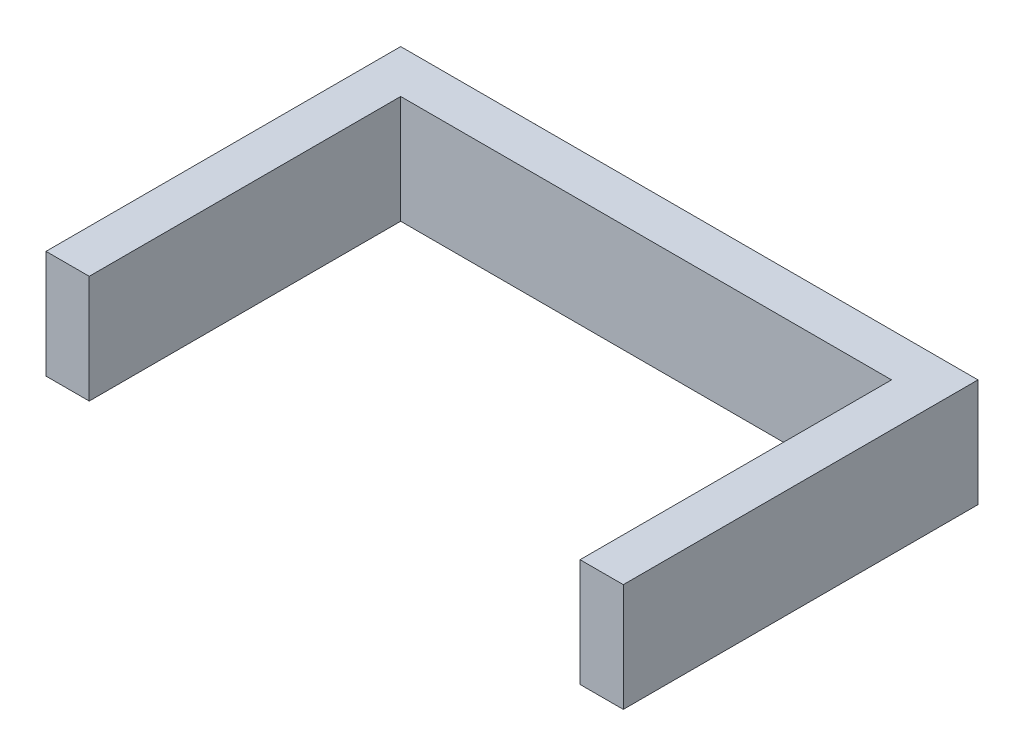
ISO-10303-21;
HEADER;
FILE_DESCRIPTION(('STEP AP214'),'2;1');
FILE_NAME('part.step','',(''),(''),'','','');
FILE_SCHEMA(('AUTOMOTIVE_DESIGN { 1 0 10303 214 1 1 1 1 }'));
ENDSEC;
DATA;
#1=APPLICATION_CONTEXT('core data for automotive mechanical design processes');
#2=APPLICATION_PROTOCOL_DEFINITION('international standard','automotive_design',2000,#1);
#3=PRODUCT_CONTEXT('',#1,'mechanical');
#4=PRODUCT('Part','Part','',(#3));
#5=PRODUCT_RELATED_PRODUCT_CATEGORY('part','',(#4));
#6=PRODUCT_DEFINITION_FORMATION('','',#4);
#7=PRODUCT_DEFINITION_CONTEXT('part definition',#1,'design');
#8=PRODUCT_DEFINITION('design','',#6,#7);
#9=PRODUCT_DEFINITION_SHAPE('','',#8);
#10=(LENGTH_UNIT() NAMED_UNIT(*) SI_UNIT(.MILLI.,.METRE.));
#11=(NAMED_UNIT(*) PLANE_ANGLE_UNIT() SI_UNIT($,.RADIAN.));
#12=(NAMED_UNIT(*) SI_UNIT($,.STERADIAN.) SOLID_ANGLE_UNIT());
#13=UNCERTAINTY_MEASURE_WITH_UNIT(LENGTH_MEASURE(1.E-05),#10,'distance_accuracy_value','');
#14=(GEOMETRIC_REPRESENTATION_CONTEXT(3) GLOBAL_UNCERTAINTY_ASSIGNED_CONTEXT((#13)) GLOBAL_UNIT_ASSIGNED_CONTEXT((#10,
#11,#12)) REPRESENTATION_CONTEXT('',''));
#15=CARTESIAN_POINT('',(0.,0.,0.));
#16=DIRECTION('',(0.,0.,1.));
#17=DIRECTION('',(1.,0.,0.));
#18=AXIS2_PLACEMENT_3D('',#15,#16,#17);
#19=CARTESIAN_POINT('',(-2.,5.,0.));
#20=DIRECTION('',(0.,0.,-1.));
#21=DIRECTION('',(-1.,0.,0.));
#22=AXIS2_PLACEMENT_3D('',#19,#20,#21);
#23=PLANE('',#22);
#24=DIRECTION('',(1.,0.,0.));
#25=VECTOR('',#24,1.);
#26=CARTESIAN_POINT('',(-2.,0.,0.));
#27=LINE('',#26,#25);
#28=CARTESIAN_POINT('',(-2.,0.,0.));
#29=VERTEX_POINT('',#28);
#30=CARTESIAN_POINT('',(0.,0.,0.));
#31=VERTEX_POINT('',#30);
#32=EDGE_CURVE('E146',#29,#31,#27,.T.);
#33=ORIENTED_EDGE('',*,*,#32,.T.);
#34=DIRECTION('',(0.,-1.,0.));
#35=VECTOR('',#34,1.);
#36=CARTESIAN_POINT('',(0.,5.,0.));
#37=LINE('',#36,#35);
#38=CARTESIAN_POINT('',(0.,5.,0.));
#39=VERTEX_POINT('',#38);
#40=EDGE_CURVE('E11',#39,#31,#37,.T.);
#41=ORIENTED_EDGE('',*,*,#40,.F.);
#42=DIRECTION('',(1.,0.,0.));
#43=VECTOR('',#42,1.);
#44=CARTESIAN_POINT('',(-2.,5.,0.));
#45=LINE('',#44,#43);
#46=CARTESIAN_POINT('',(-2.,5.,0.));
#47=VERTEX_POINT('',#46);
#48=EDGE_CURVE('E168',#47,#39,#45,.T.);
#49=ORIENTED_EDGE('',*,*,#48,.F.);
#50=DIRECTION('',(0.,-1.,0.));
#51=VECTOR('',#50,1.);
#52=CARTESIAN_POINT('',(-2.,5.,0.));
#53=LINE('',#52,#51);
#54=EDGE_CURVE('E142',#47,#29,#53,.T.);
#55=ORIENTED_EDGE('',*,*,#54,.T.);
#56=EDGE_LOOP('',(#33,#41,#49,#55));
#57=FACE_BOUND('',#56,.T.);
#58=ADVANCED_FACE('F45',(#57),#23,.F.);
#59=CARTESIAN_POINT('',(0.,5.,0.));
#60=DIRECTION('',(-1.,0.,0.));
#61=DIRECTION('',(0.,0.,1.));
#62=AXIS2_PLACEMENT_3D('',#59,#60,#61);
#63=PLANE('',#62);
#64=DIRECTION('',(0.,0.,-1.));
#65=VECTOR('',#64,1.);
#66=CARTESIAN_POINT('',(0.,0.,0.));
#67=LINE('',#66,#65);
#68=CARTESIAN_POINT('',(0.,0.,-14.41));
#69=VERTEX_POINT('',#68);
#70=EDGE_CURVE('E150',#31,#69,#67,.T.);
#71=ORIENTED_EDGE('',*,*,#70,.T.);
#72=DIRECTION('',(0.,-1.,0.));
#73=VECTOR('',#72,1.);
#74=CARTESIAN_POINT('',(0.,5.,-14.41));
#75=LINE('',#74,#73);
#76=CARTESIAN_POINT('',(0.,5.,-14.41));
#77=VERTEX_POINT('',#76);
#78=EDGE_CURVE('E54',#77,#69,#75,.T.);
#79=ORIENTED_EDGE('',*,*,#78,.F.);
#80=DIRECTION('',(0.,0.,-1.));
#81=VECTOR('',#80,1.);
#82=CARTESIAN_POINT('',(0.,5.,0.));
#83=LINE('',#82,#81);
#84=EDGE_CURVE('E105',#39,#77,#83,.T.);
#85=ORIENTED_EDGE('',*,*,#84,.F.);
#86=ORIENTED_EDGE('',*,*,#40,.T.);
#87=EDGE_LOOP('',(#71,#79,#85,#86));
#88=FACE_BOUND('',#87,.T.);
#89=ADVANCED_FACE('F214',(#88),#63,.F.);
#90=CARTESIAN_POINT('',(0.,5.,-14.41));
#91=DIRECTION('',(0.,0.,-1.));
#92=DIRECTION('',(-1.,0.,0.));
#93=AXIS2_PLACEMENT_3D('',#90,#91,#92);
#94=PLANE('',#93);
#95=DIRECTION('',(1.,0.,0.));
#96=VECTOR('',#95,1.);
#97=CARTESIAN_POINT('',(0.,0.,-14.41));
#98=LINE('',#97,#96);
#99=CARTESIAN_POINT('',(22.71,0.,-14.41));
#100=VERTEX_POINT('',#99);
#101=EDGE_CURVE('E153',#69,#100,#98,.T.);
#102=ORIENTED_EDGE('',*,*,#101,.T.);
#103=DIRECTION('',(0.,-1.,0.));
#104=VECTOR('',#103,1.);
#105=CARTESIAN_POINT('',(22.71,5.,-14.41));
#106=LINE('',#105,#104);
#107=CARTESIAN_POINT('',(22.71,5.,-14.41));
#108=VERTEX_POINT('',#107);
#109=EDGE_CURVE('E179',#108,#100,#106,.T.);
#110=ORIENTED_EDGE('',*,*,#109,.F.);
#111=DIRECTION('',(1.,0.,0.));
#112=VECTOR('',#111,1.);
#113=CARTESIAN_POINT('',(0.,5.,-14.41));
#114=LINE('',#113,#112);
#115=EDGE_CURVE('E189',#77,#108,#114,.T.);
#116=ORIENTED_EDGE('',*,*,#115,.F.);
#117=ORIENTED_EDGE('',*,*,#78,.T.);
#118=EDGE_LOOP('',(#102,#110,#116,#117));
#119=FACE_BOUND('',#118,.T.);
#120=ADVANCED_FACE('F187',(#119),#94,.F.);
#121=CARTESIAN_POINT('',(22.71,5.,0.));
#122=DIRECTION('',(1.,0.,0.));
#123=DIRECTION('',(0.,0.,-1.));
#124=AXIS2_PLACEMENT_3D('',#121,#122,#123);
#125=PLANE('',#124);
#126=DIRECTION('',(0.,0.,1.));
#127=VECTOR('',#126,1.);
#128=CARTESIAN_POINT('',(22.71,0.,0.));
#129=LINE('',#128,#127);
#130=CARTESIAN_POINT('',(22.71,0.,0.));
#131=VERTEX_POINT('',#130);
#132=EDGE_CURVE('E156',#100,#131,#129,.T.);
#133=ORIENTED_EDGE('',*,*,#132,.T.);
#134=DIRECTION('',(0.,-1.,0.));
#135=VECTOR('',#134,1.);
#136=CARTESIAN_POINT('',(22.71,5.,0.));
#137=LINE('',#136,#135);
#138=CARTESIAN_POINT('',(22.71,5.,0.));
#139=VERTEX_POINT('',#138);
#140=EDGE_CURVE('E175',#139,#131,#137,.T.);
#141=ORIENTED_EDGE('',*,*,#140,.F.);
#142=DIRECTION('',(0.,0.,1.));
#143=VECTOR('',#142,1.);
#144=CARTESIAN_POINT('',(22.71,5.,0.));
#145=LINE('',#144,#143);
#146=EDGE_CURVE('E202',#108,#139,#145,.T.);
#147=ORIENTED_EDGE('',*,*,#146,.F.);
#148=ORIENTED_EDGE('',*,*,#109,.T.);
#149=EDGE_LOOP('',(#133,#141,#147,#148));
#150=FACE_BOUND('',#149,.T.);
#151=ADVANCED_FACE('F197',(#150),#125,.F.);
#152=CARTESIAN_POINT('',(22.71,5.,0.));
#153=DIRECTION('',(0.,0.,-1.));
#154=DIRECTION('',(-1.,0.,0.));
#155=AXIS2_PLACEMENT_3D('',#152,#153,#154);
#156=PLANE('',#155);
#157=DIRECTION('',(1.,0.,0.));
#158=VECTOR('',#157,1.);
#159=CARTESIAN_POINT('',(22.71,0.,0.));
#160=LINE('',#159,#158);
#161=CARTESIAN_POINT('',(24.71,0.,0.));
#162=VERTEX_POINT('',#161);
#163=EDGE_CURVE('E159',#131,#162,#160,.T.);
#164=ORIENTED_EDGE('',*,*,#163,.T.);
#165=DIRECTION('',(0.,-1.,0.));
#166=VECTOR('',#165,1.);
#167=CARTESIAN_POINT('',(24.71,5.,0.));
#168=LINE('',#167,#166);
#169=CARTESIAN_POINT('',(24.71,5.,0.));
#170=VERTEX_POINT('',#169);
#171=EDGE_CURVE('E135',#170,#162,#168,.T.);
#172=ORIENTED_EDGE('',*,*,#171,.F.);
#173=DIRECTION('',(1.,0.,0.));
#174=VECTOR('',#173,1.);
#175=CARTESIAN_POINT('',(22.71,5.,0.));
#176=LINE('',#175,#174);
#177=EDGE_CURVE('E124',#139,#170,#176,.T.);
#178=ORIENTED_EDGE('',*,*,#177,.F.);
#179=ORIENTED_EDGE('',*,*,#140,.T.);
#180=EDGE_LOOP('',(#164,#172,#178,#179));
#181=FACE_BOUND('',#180,.T.);
#182=ADVANCED_FACE('F200',(#181),#156,.F.);
#183=CARTESIAN_POINT('',(24.71,5.,0.));
#184=DIRECTION('',(-1.,0.,0.));
#185=DIRECTION('',(0.,0.,1.));
#186=AXIS2_PLACEMENT_3D('',#183,#184,#185);
#187=PLANE('',#186);
#188=DIRECTION('',(0.,0.,-1.));
#189=VECTOR('',#188,1.);
#190=CARTESIAN_POINT('',(24.71,0.,0.));
#191=LINE('',#190,#189);
#192=CARTESIAN_POINT('',(24.71,0.,-16.41));
#193=VERTEX_POINT('',#192);
#194=EDGE_CURVE('E133',#162,#193,#191,.T.);
#195=ORIENTED_EDGE('',*,*,#194,.T.);
#196=DIRECTION('',(0.,-1.,0.));
#197=VECTOR('',#196,1.);
#198=CARTESIAN_POINT('',(24.71,5.,-16.41));
#199=LINE('',#198,#197);
#200=CARTESIAN_POINT('',(24.71,5.,-16.41));
#201=VERTEX_POINT('',#200);
#202=EDGE_CURVE('E130',#201,#193,#199,.T.);
#203=ORIENTED_EDGE('',*,*,#202,.F.);
#204=DIRECTION('',(0.,0.,-1.));
#205=VECTOR('',#204,1.);
#206=CARTESIAN_POINT('',(24.71,5.,0.));
#207=LINE('',#206,#205);
#208=EDGE_CURVE('E118',#170,#201,#207,.T.);
#209=ORIENTED_EDGE('',*,*,#208,.F.);
#210=ORIENTED_EDGE('',*,*,#171,.T.);
#211=EDGE_LOOP('',(#195,#203,#209,#210));
#212=FACE_BOUND('',#211,.T.);
#213=ADVANCED_FACE('F131',(#212),#187,.F.);
#214=CARTESIAN_POINT('',(-2.,5.,-16.41));
#215=DIRECTION('',(0.,0.,1.));
#216=DIRECTION('',(1.,0.,0.));
#217=AXIS2_PLACEMENT_3D('',#214,#215,#216);
#218=PLANE('',#217);
#219=DIRECTION('',(-1.,0.,0.));
#220=VECTOR('',#219,1.);
#221=CARTESIAN_POINT('',(-2.,0.,-16.41));
#222=LINE('',#221,#220);
#223=CARTESIAN_POINT('',(-2.,0.,-16.41));
#224=VERTEX_POINT('',#223);
#225=EDGE_CURVE('E91',#193,#224,#222,.T.);
#226=ORIENTED_EDGE('',*,*,#225,.T.);
#227=DIRECTION('',(0.,-1.,0.));
#228=VECTOR('',#227,1.);
#229=CARTESIAN_POINT('',(-2.,5.,-16.41));
#230=LINE('',#229,#228);
#231=CARTESIAN_POINT('',(-2.,5.,-16.41));
#232=VERTEX_POINT('',#231);
#233=EDGE_CURVE('E136',#232,#224,#230,.T.);
#234=ORIENTED_EDGE('',*,*,#233,.F.);
#235=DIRECTION('',(-1.,0.,0.));
#236=VECTOR('',#235,1.);
#237=CARTESIAN_POINT('',(-2.,5.,-16.41));
#238=LINE('',#237,#236);
#239=EDGE_CURVE('E122',#201,#232,#238,.T.);
#240=ORIENTED_EDGE('',*,*,#239,.F.);
#241=ORIENTED_EDGE('',*,*,#202,.T.);
#242=EDGE_LOOP('',(#226,#234,#240,#241));
#243=FACE_BOUND('',#242,.T.);
#244=ADVANCED_FACE('F138',(#243),#218,.F.);
#245=CARTESIAN_POINT('',(-2.,5.,0.));
#246=DIRECTION('',(1.,0.,0.));
#247=DIRECTION('',(0.,0.,-1.));
#248=AXIS2_PLACEMENT_3D('',#245,#246,#247);
#249=PLANE('',#248);
#250=DIRECTION('',(0.,0.,1.));
#251=VECTOR('',#250,1.);
#252=CARTESIAN_POINT('',(-2.,0.,0.));
#253=LINE('',#252,#251);
#254=EDGE_CURVE('E97',#224,#29,#253,.T.);
#255=ORIENTED_EDGE('',*,*,#254,.T.);
#256=ORIENTED_EDGE('',*,*,#54,.F.);
#257=DIRECTION('',(0.,0.,1.));
#258=VECTOR('',#257,1.);
#259=CARTESIAN_POINT('',(-2.,5.,0.));
#260=LINE('',#259,#258);
#261=EDGE_CURVE('E62',#232,#47,#260,.T.);
#262=ORIENTED_EDGE('',*,*,#261,.F.);
#263=ORIENTED_EDGE('',*,*,#233,.T.);
#264=EDGE_LOOP('',(#255,#256,#262,#263));
#265=FACE_BOUND('',#264,.T.);
#266=ADVANCED_FACE('F230',(#265),#249,.F.);
#267=CARTESIAN_POINT('',(0.,5.,0.));
#268=DIRECTION('',(0.,1.,0.));
#269=DIRECTION('',(0.,0.,1.));
#270=AXIS2_PLACEMENT_3D('',#267,#268,#269);
#271=PLANE('',#270);
#272=ORIENTED_EDGE('',*,*,#48,.T.);
#273=ORIENTED_EDGE('',*,*,#84,.T.);
#274=ORIENTED_EDGE('',*,*,#115,.T.);
#275=ORIENTED_EDGE('',*,*,#146,.T.);
#276=ORIENTED_EDGE('',*,*,#177,.T.);
#277=ORIENTED_EDGE('',*,*,#208,.T.);
#278=ORIENTED_EDGE('',*,*,#239,.T.);
#279=ORIENTED_EDGE('',*,*,#261,.T.);
#280=EDGE_LOOP('',(#272,#273,#274,#275,#276,#277,#278,#279));
#281=FACE_BOUND('',#280,.T.);
#282=ADVANCED_FACE('F120',(#281),#271,.T.);
#283=CARTESIAN_POINT('',(0.,0.,0.));
#284=DIRECTION('',(0.,1.,0.));
#285=DIRECTION('',(0.,0.,1.));
#286=AXIS2_PLACEMENT_3D('',#283,#284,#285);
#287=PLANE('',#286);
#288=ORIENTED_EDGE('',*,*,#32,.F.);
#289=ORIENTED_EDGE('',*,*,#254,.F.);
#290=ORIENTED_EDGE('',*,*,#225,.F.);
#291=ORIENTED_EDGE('',*,*,#194,.F.);
#292=ORIENTED_EDGE('',*,*,#163,.F.);
#293=ORIENTED_EDGE('',*,*,#132,.F.);
#294=ORIENTED_EDGE('',*,*,#101,.F.);
#295=ORIENTED_EDGE('',*,*,#70,.F.);
#296=EDGE_LOOP('',(#288,#289,#290,#291,#292,#293,#294,#295));
#297=FACE_BOUND('',#296,.T.);
#298=ADVANCED_FACE('F193',(#297),#287,.F.);
#299=CLOSED_SHELL('',(#58,#89,#120,#151,#182,#213,#244,#266,#282,#298));
#300=MANIFOLD_SOLID_BREP('B2',#299);
#301=ADVANCED_BREP_SHAPE_REPRESENTATION('',(#18,#300),#14);
#302=SHAPE_DEFINITION_REPRESENTATION(#9,#301);
ENDSEC;
END-ISO-10303-21;
